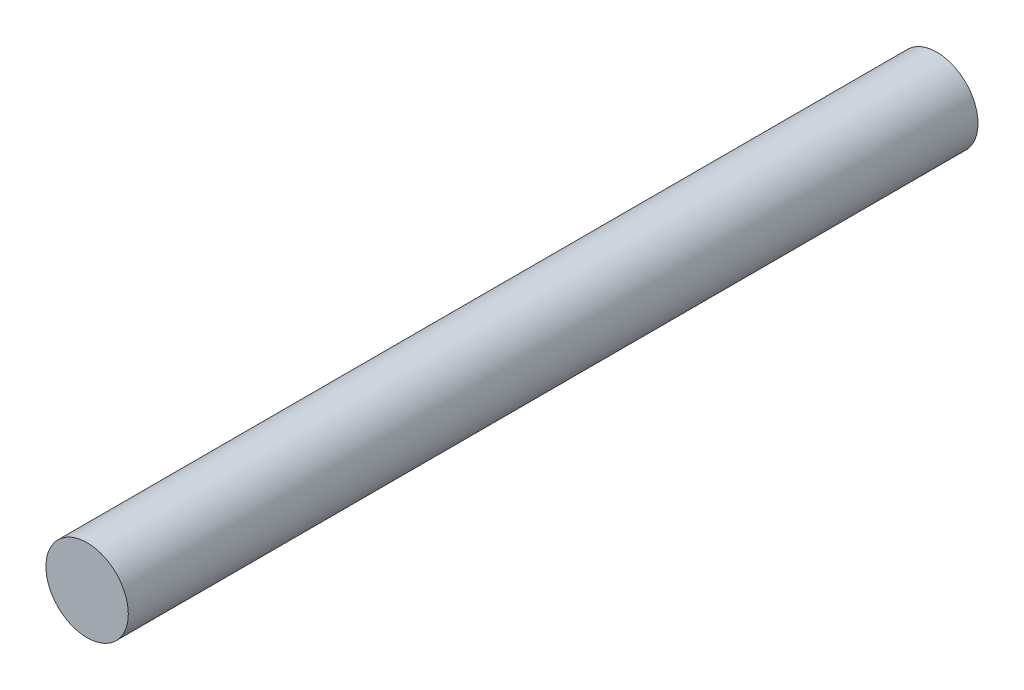
ISO-10303-21;
HEADER;
FILE_DESCRIPTION(('STEP AP214'),'2;1');
FILE_NAME('part.step','',(''),(''),'','','');
FILE_SCHEMA(('AUTOMOTIVE_DESIGN { 1 0 10303 214 1 1 1 1 }'));
ENDSEC;
DATA;
#1=APPLICATION_CONTEXT('core data for automotive mechanical design processes');
#2=APPLICATION_PROTOCOL_DEFINITION('international standard','automotive_design',2000,#1);
#3=PRODUCT_CONTEXT('',#1,'mechanical');
#4=PRODUCT('Part','Part','',(#3));
#5=PRODUCT_RELATED_PRODUCT_CATEGORY('part','',(#4));
#6=PRODUCT_DEFINITION_FORMATION('','',#4);
#7=PRODUCT_DEFINITION_CONTEXT('part definition',#1,'design');
#8=PRODUCT_DEFINITION('design','',#6,#7);
#9=PRODUCT_DEFINITION_SHAPE('','',#8);
#10=(LENGTH_UNIT() NAMED_UNIT(*) SI_UNIT(.MILLI.,.METRE.));
#11=(NAMED_UNIT(*) PLANE_ANGLE_UNIT() SI_UNIT($,.RADIAN.));
#12=(NAMED_UNIT(*) SI_UNIT($,.STERADIAN.) SOLID_ANGLE_UNIT());
#13=UNCERTAINTY_MEASURE_WITH_UNIT(LENGTH_MEASURE(1.E-05),#10,'distance_accuracy_value','');
#14=(GEOMETRIC_REPRESENTATION_CONTEXT(3) GLOBAL_UNCERTAINTY_ASSIGNED_CONTEXT((#13)) GLOBAL_UNIT_ASSIGNED_CONTEXT((#10,
#11,#12)) REPRESENTATION_CONTEXT('',''));
#15=CARTESIAN_POINT('',(0.,0.,0.));
#16=DIRECTION('',(0.,0.,1.));
#17=DIRECTION('',(1.,0.,0.));
#18=AXIS2_PLACEMENT_3D('',#15,#16,#17);
#19=CARTESIAN_POINT('',(0.,0.,83.82));
#20=DIRECTION('',(0.,0.,-1.));
#21=DIRECTION('',(-1.,0.,0.));
#22=AXIS2_PLACEMENT_3D('',#19,#20,#21);
#23=CYLINDRICAL_SURFACE('',#22,4.064);
#24=CARTESIAN_POINT('',(0.,0.,83.82));
#25=DIRECTION('',(0.,0.,1.));
#26=DIRECTION('',(1.,0.,0.));
#27=AXIS2_PLACEMENT_3D('',#24,#25,#26);
#28=CIRCLE('',#27,4.064);
#29=CARTESIAN_POINT('',(4.064,0.,83.82));
#30=VERTEX_POINT('',#29);
#31=EDGE_CURVE('E10',#30,#30,#28,.T.);
#32=ORIENTED_EDGE('',*,*,#31,.F.);
#33=EDGE_LOOP('',(#32));
#34=FACE_BOUND('',#33,.T.);
#35=CARTESIAN_POINT('',(0.,0.,0.));
#36=DIRECTION('',(0.,0.,1.));
#37=DIRECTION('',(1.,0.,0.));
#38=AXIS2_PLACEMENT_3D('',#35,#36,#37);
#39=CIRCLE('',#38,4.064);
#40=CARTESIAN_POINT('',(4.064,0.,0.));
#41=VERTEX_POINT('',#40);
#42=EDGE_CURVE('E45',#41,#41,#39,.T.);
#43=ORIENTED_EDGE('',*,*,#42,.T.);
#44=EDGE_LOOP('',(#43));
#45=FACE_BOUND('',#44,.T.);
#46=ADVANCED_FACE('F39',(#34,#45),#23,.T.);
#47=CARTESIAN_POINT('',(0.,0.,83.82));
#48=DIRECTION('',(0.,0.,1.));
#49=DIRECTION('',(1.,0.,0.));
#50=AXIS2_PLACEMENT_3D('',#47,#48,#49);
#51=PLANE('',#50);
#52=ORIENTED_EDGE('',*,*,#31,.T.);
#53=EDGE_LOOP('',(#52));
#54=FACE_BOUND('',#53,.T.);
#55=ADVANCED_FACE('F53',(#54),#51,.T.);
#56=CARTESIAN_POINT('',(0.,0.,0.));
#57=DIRECTION('',(0.,0.,1.));
#58=DIRECTION('',(1.,0.,0.));
#59=AXIS2_PLACEMENT_3D('',#56,#57,#58);
#60=PLANE('',#59);
#61=ORIENTED_EDGE('',*,*,#42,.F.);
#62=EDGE_LOOP('',(#61));
#63=FACE_BOUND('',#62,.T.);
#64=ADVANCED_FACE('F55',(#63),#60,.F.);
#65=CLOSED_SHELL('',(#46,#55,#64));
#66=MANIFOLD_SOLID_BREP('B2',#65);
#67=ADVANCED_BREP_SHAPE_REPRESENTATION('',(#18,#66),#14);
#68=SHAPE_DEFINITION_REPRESENTATION(#9,#67);
ENDSEC;
END-ISO-10303-21;
